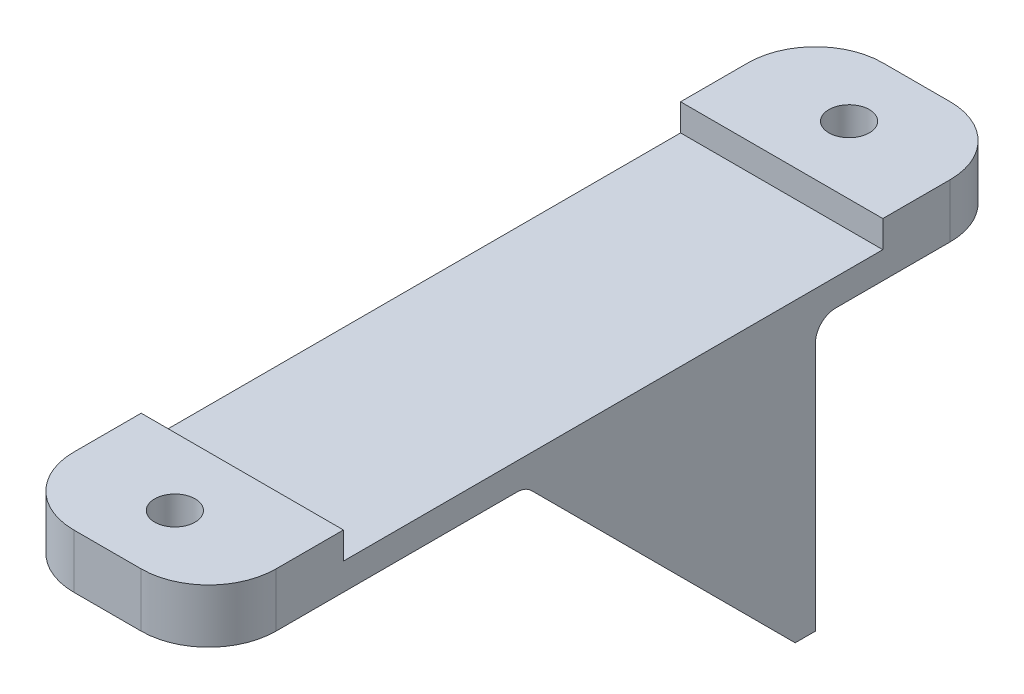
ISO-10303-21;
HEADER;
FILE_DESCRIPTION(('STEP AP214'),'2;1');
FILE_NAME('part.step','',(''),(''),'','','');
FILE_SCHEMA(('AUTOMOTIVE_DESIGN { 1 0 10303 214 1 1 1 1 }'));
ENDSEC;
DATA;
#1=APPLICATION_CONTEXT('core data for automotive mechanical design processes');
#2=APPLICATION_PROTOCOL_DEFINITION('international standard','automotive_design',2000,#1);
#3=PRODUCT_CONTEXT('',#1,'mechanical');
#4=PRODUCT('Part','Part','',(#3));
#5=PRODUCT_RELATED_PRODUCT_CATEGORY('part','',(#4));
#6=PRODUCT_DEFINITION_FORMATION('','',#4);
#7=PRODUCT_DEFINITION_CONTEXT('part definition',#1,'design');
#8=PRODUCT_DEFINITION('design','',#6,#7);
#9=PRODUCT_DEFINITION_SHAPE('','',#8);
#10=(LENGTH_UNIT() NAMED_UNIT(*) SI_UNIT(.MILLI.,.METRE.));
#11=(NAMED_UNIT(*) PLANE_ANGLE_UNIT() SI_UNIT($,.RADIAN.));
#12=(NAMED_UNIT(*) SI_UNIT($,.STERADIAN.) SOLID_ANGLE_UNIT());
#13=UNCERTAINTY_MEASURE_WITH_UNIT(LENGTH_MEASURE(1.E-05),#10,'distance_accuracy_value','');
#14=(GEOMETRIC_REPRESENTATION_CONTEXT(3) GLOBAL_UNCERTAINTY_ASSIGNED_CONTEXT((#13)) GLOBAL_UNIT_ASSIGNED_CONTEXT((#10,
#11,#12)) REPRESENTATION_CONTEXT('',''));
#15=CARTESIAN_POINT('',(0.,0.,0.));
#16=DIRECTION('',(0.,0.,1.));
#17=DIRECTION('',(1.,0.,0.));
#18=AXIS2_PLACEMENT_3D('',#15,#16,#17);
#19=CARTESIAN_POINT('',(0.,-40.,-87.));
#20=DIRECTION('',(0.,0.,-1.));
#21=DIRECTION('',(-1.,0.,0.));
#22=AXIS2_PLACEMENT_3D('',#19,#20,#21);
#23=PLANE('',#22);
#24=CARTESIAN_POINT('',(15.,-20.,-87.));
#25=DIRECTION('',(0.,0.,1.));
#26=DIRECTION('',(1.,0.,0.));
#27=AXIS2_PLACEMENT_3D('',#24,#25,#26);
#28=CIRCLE('',#27,9.1);
#29=CARTESIAN_POINT('',(24.1,-20.,-87.));
#30=VERTEX_POINT('',#29);
#31=EDGE_CURVE('E226',#30,#30,#28,.T.);
#32=ORIENTED_EDGE('',*,*,#31,.F.);
#33=EDGE_LOOP('',(#32));
#34=FACE_BOUND('',#33,.T.);
#35=DIRECTION('',(0.,-1.,0.));
#36=VECTOR('',#35,1.);
#37=CARTESIAN_POINT('',(2.5,-40.,-87.));
#38=LINE('',#37,#36);
#39=CARTESIAN_POINT('',(2.5,0.,-87.));
#40=VERTEX_POINT('',#39);
#41=CARTESIAN_POINT('',(2.5,-40.,-87.));
#42=VERTEX_POINT('',#41);
#43=EDGE_CURVE('E192',#40,#42,#38,.T.);
#44=ORIENTED_EDGE('',*,*,#43,.T.);
#45=DIRECTION('',(-1.,0.,0.));
#46=VECTOR('',#45,1.);
#47=CARTESIAN_POINT('',(0.,-40.,-87.));
#48=LINE('',#47,#46);
#49=CARTESIAN_POINT('',(27.5,-40.,-87.));
#50=VERTEX_POINT('',#49);
#51=EDGE_CURVE('E435',#50,#42,#48,.T.);
#52=ORIENTED_EDGE('',*,*,#51,.F.);
#53=DIRECTION('',(0.,1.,0.));
#54=VECTOR('',#53,1.);
#55=CARTESIAN_POINT('',(27.5,0.,-87.));
#56=LINE('',#55,#54);
#57=CARTESIAN_POINT('',(27.5,0.,-87.));
#58=VERTEX_POINT('',#57);
#59=EDGE_CURVE('E215',#50,#58,#56,.T.);
#60=ORIENTED_EDGE('',*,*,#59,.T.);
#61=DIRECTION('',(-1.,0.,0.));
#62=VECTOR('',#61,1.);
#63=CARTESIAN_POINT('',(0.,0.,-87.));
#64=LINE('',#63,#62);
#65=EDGE_CURVE('E207',#58,#40,#64,.T.);
#66=ORIENTED_EDGE('',*,*,#65,.T.);
#67=EDGE_LOOP('',(#44,#52,#60,#66));
#68=FACE_BOUND('',#67,.T.);
#69=ADVANCED_FACE('F45',(#34,#68),#23,.F.);
#70=CARTESIAN_POINT('',(0.,0.,0.));
#71=DIRECTION('',(0.,-1.,0.));
#72=DIRECTION('',(0.,0.,-1.));
#73=AXIS2_PLACEMENT_3D('',#70,#71,#72);
#74=PLANE('',#73);
#75=CARTESIAN_POINT('',(15.,0.,-10.));
#76=DIRECTION('',(0.,-1.,0.));
#77=DIRECTION('',(0.,0.,-1.));
#78=AXIS2_PLACEMENT_3D('',#75,#76,#77);
#79=CIRCLE('',#78,3.);
#80=CARTESIAN_POINT('',(15.,0.,-13.));
#81=VERTEX_POINT('',#80);
#82=EDGE_CURVE('E593',#81,#81,#79,.T.);
#83=ORIENTED_EDGE('',*,*,#82,.F.);
#84=EDGE_LOOP('',(#83));
#85=FACE_BOUND('',#84,.T.);
#86=DIRECTION('',(0.,0.,1.));
#87=VECTOR('',#86,1.);
#88=CARTESIAN_POINT('',(27.5,0.,-46.9999999999996));
#89=LINE('',#88,#87);
#90=CARTESIAN_POINT('',(27.5,0.,-45.7573593128803));
#91=VERTEX_POINT('',#90);
#92=EDGE_CURVE('E420',#58,#91,#89,.T.);
#93=ORIENTED_EDGE('',*,*,#92,.T.);
#94=DIRECTION('',(1.,0.,0.));
#95=VECTOR('',#94,1.);
#96=CARTESIAN_POINT('',(30.,0.,-45.7573593128803));
#97=LINE('',#96,#95);
#98=CARTESIAN_POINT('',(30.,0.,-45.7573593128803));
#99=VERTEX_POINT('',#98);
#100=EDGE_CURVE('E380',#91,#99,#97,.T.);
#101=ORIENTED_EDGE('',*,*,#100,.T.);
#102=DIRECTION('',(0.,0.,-1.));
#103=VECTOR('',#102,1.);
#104=CARTESIAN_POINT('',(30.,0.,0.));
#105=LINE('',#104,#103);
#106=CARTESIAN_POINT('',(30.,0.,-10.));
#107=VERTEX_POINT('',#106);
#108=EDGE_CURVE('E304',#107,#99,#105,.T.);
#109=ORIENTED_EDGE('',*,*,#108,.F.);
#110=CARTESIAN_POINT('',(20.,0.,-10.));
#111=DIRECTION('',(0.,-1.,0.));
#112=DIRECTION('',(0.,0.,-1.));
#113=AXIS2_PLACEMENT_3D('',#110,#111,#112);
#114=CIRCLE('',#113,10.);
#115=CARTESIAN_POINT('',(20.,0.,0.));
#116=VERTEX_POINT('',#115);
#117=EDGE_CURVE('E349',#107,#116,#114,.T.);
#118=ORIENTED_EDGE('',*,*,#117,.T.);
#119=DIRECTION('',(1.,0.,0.));
#120=VECTOR('',#119,1.);
#121=CARTESIAN_POINT('',(0.,0.,0.));
#122=LINE('',#121,#120);
#123=CARTESIAN_POINT('',(10.,0.,0.));
#124=VERTEX_POINT('',#123);
#125=EDGE_CURVE('E299',#124,#116,#122,.T.);
#126=ORIENTED_EDGE('',*,*,#125,.F.);
#127=CARTESIAN_POINT('',(10.,0.,-10.));
#128=DIRECTION('',(0.,-1.,0.));
#129=DIRECTION('',(0.,0.,-1.));
#130=AXIS2_PLACEMENT_3D('',#127,#128,#129);
#131=CIRCLE('',#130,10.);
#132=CARTESIAN_POINT('',(0.,0.,-10.));
#133=VERTEX_POINT('',#132);
#134=EDGE_CURVE('E345',#124,#133,#131,.T.);
#135=ORIENTED_EDGE('',*,*,#134,.T.);
#136=DIRECTION('',(0.,0.,1.));
#137=VECTOR('',#136,1.);
#138=CARTESIAN_POINT('',(0.,0.,0.));
#139=LINE('',#138,#137);
#140=CARTESIAN_POINT('',(0.,0.,-45.7573593128803));
#141=VERTEX_POINT('',#140);
#142=EDGE_CURVE('E268',#141,#133,#139,.T.);
#143=ORIENTED_EDGE('',*,*,#142,.F.);
#144=DIRECTION('',(-1.,0.,0.));
#145=VECTOR('',#144,1.);
#146=CARTESIAN_POINT('',(2.5,0.,-45.7573593128803));
#147=LINE('',#146,#145);
#148=CARTESIAN_POINT('',(2.5,0.,-45.7573593128803));
#149=VERTEX_POINT('',#148);
#150=EDGE_CURVE('E209',#141,#149,#147,.F.);
#151=ORIENTED_EDGE('',*,*,#150,.T.);
#152=DIRECTION('',(0.,0.,-1.));
#153=VECTOR('',#152,1.);
#154=CARTESIAN_POINT('',(2.5,0.,-87.));
#155=LINE('',#154,#153);
#156=EDGE_CURVE('E195',#149,#40,#155,.T.);
#157=ORIENTED_EDGE('',*,*,#156,.T.);
#158=ORIENTED_EDGE('',*,*,#65,.F.);
#159=EDGE_LOOP('',(#93,#101,#109,#118,#126,#135,#143,#151,#157,#158));
#160=FACE_BOUND('',#159,.T.);
#161=ADVANCED_FACE('F206',(#85,#160),#74,.T.);
#162=CARTESIAN_POINT('',(0.,8.,0.));
#163=DIRECTION('',(0.,-1.,0.));
#164=DIRECTION('',(0.,0.,-1.));
#165=AXIS2_PLACEMENT_3D('',#162,#163,#164);
#166=PLANE('',#165);
#167=CARTESIAN_POINT('',(15.,8.,-110.));
#168=DIRECTION('',(0.,-1.,0.));
#169=DIRECTION('',(0.,0.,-1.));
#170=AXIS2_PLACEMENT_3D('',#167,#168,#169);
#171=CIRCLE('',#170,3.);
#172=CARTESIAN_POINT('',(15.,8.,-113.));
#173=VERTEX_POINT('',#172);
#174=EDGE_CURVE('E586',#173,#173,#171,.T.);
#175=ORIENTED_EDGE('',*,*,#174,.T.);
#176=EDGE_LOOP('',(#175));
#177=FACE_BOUND('',#176,.T.);
#178=DIRECTION('',(0.,0.,-1.));
#179=VECTOR('',#178,1.);
#180=CARTESIAN_POINT('',(30.,8.,0.));
#181=LINE('',#180,#179);
#182=CARTESIAN_POINT('',(30.,8.,-100.));
#183=VERTEX_POINT('',#182);
#184=CARTESIAN_POINT('',(30.,8.,-110.));
#185=VERTEX_POINT('',#184);
#186=EDGE_CURVE('E286',#183,#185,#181,.T.);
#187=ORIENTED_EDGE('',*,*,#186,.T.);
#188=CARTESIAN_POINT('',(20.,8.,-110.));
#189=DIRECTION('',(0.,-1.,0.));
#190=DIRECTION('',(0.,0.,-1.));
#191=AXIS2_PLACEMENT_3D('',#188,#189,#190);
#192=CIRCLE('',#191,10.);
#193=CARTESIAN_POINT('',(20.,8.,-120.));
#194=VERTEX_POINT('',#193);
#195=EDGE_CURVE('E335',#185,#194,#192,.F.);
#196=ORIENTED_EDGE('',*,*,#195,.T.);
#197=DIRECTION('',(-1.,0.,0.));
#198=VECTOR('',#197,1.);
#199=CARTESIAN_POINT('',(0.,8.,-120.));
#200=LINE('',#199,#198);
#201=CARTESIAN_POINT('',(10.,8.,-120.));
#202=VERTEX_POINT('',#201);
#203=EDGE_CURVE('E290',#194,#202,#200,.T.);
#204=ORIENTED_EDGE('',*,*,#203,.T.);
#205=CARTESIAN_POINT('',(10.,8.,-110.));
#206=DIRECTION('',(0.,-1.,0.));
#207=DIRECTION('',(0.,0.,-1.));
#208=AXIS2_PLACEMENT_3D('',#205,#206,#207);
#209=CIRCLE('',#208,10.);
#210=CARTESIAN_POINT('',(0.,8.,-110.));
#211=VERTEX_POINT('',#210);
#212=EDGE_CURVE('E332',#202,#211,#209,.F.);
#213=ORIENTED_EDGE('',*,*,#212,.T.);
#214=DIRECTION('',(0.,0.,1.));
#215=VECTOR('',#214,1.);
#216=CARTESIAN_POINT('',(0.,8.,0.));
#217=LINE('',#216,#215);
#218=CARTESIAN_POINT('',(0.,8.,-100.));
#219=VERTEX_POINT('',#218);
#220=EDGE_CURVE('E278',#211,#219,#217,.T.);
#221=ORIENTED_EDGE('',*,*,#220,.T.);
#222=DIRECTION('',(-1.,0.,0.));
#223=VECTOR('',#222,1.);
#224=CARTESIAN_POINT('',(30.,8.,-100.));
#225=LINE('',#224,#223);
#226=EDGE_CURVE('E246',#183,#219,#225,.T.);
#227=ORIENTED_EDGE('',*,*,#226,.F.);
#228=EDGE_LOOP('',(#187,#196,#204,#213,#221,#227));
#229=FACE_BOUND('',#228,.T.);
#230=ADVANCED_FACE('F491',(#177,#229),#166,.F.);
#231=CARTESIAN_POINT('',(0.,8.,0.));
#232=DIRECTION('',(1.,0.,0.));
#233=DIRECTION('',(0.,0.,-1.));
#234=AXIS2_PLACEMENT_3D('',#231,#232,#233);
#235=PLANE('',#234);
#236=ORIENTED_EDGE('',*,*,#220,.F.);
#237=DIRECTION('',(0.,-1.,0.));
#238=VECTOR('',#237,1.);
#239=CARTESIAN_POINT('',(0.,8.,-110.));
#240=LINE('',#239,#238);
#241=CARTESIAN_POINT('',(0.,0.,-110.));
#242=VERTEX_POINT('',#241);
#243=EDGE_CURVE('E341',#211,#242,#240,.T.);
#244=ORIENTED_EDGE('',*,*,#243,.T.);
#245=CARTESIAN_POINT('',(0.,0.,-93.));
#246=VERTEX_POINT('',#245);
#247=EDGE_CURVE('E295',#242,#246,#139,.T.);
#248=ORIENTED_EDGE('',*,*,#247,.T.);
#249=CARTESIAN_POINT('',(0.,-3.,-93.));
#250=DIRECTION('',(1.,0.,0.));
#251=DIRECTION('',(0.,0.,-1.));
#252=AXIS2_PLACEMENT_3D('',#249,#250,#251);
#253=CIRCLE('',#252,3.);
#254=CARTESIAN_POINT('',(0.,-3.,-90.));
#255=VERTEX_POINT('',#254);
#256=EDGE_CURVE('E375',#246,#255,#253,.T.);
#257=ORIENTED_EDGE('',*,*,#256,.T.);
#258=DIRECTION('',(0.,1.,0.));
#259=VECTOR('',#258,1.);
#260=CARTESIAN_POINT('',(0.,-40.,-90.));
#261=LINE('',#260,#259);
#262=CARTESIAN_POINT('',(0.,-40.,-90.));
#263=VERTEX_POINT('',#262);
#264=EDGE_CURVE('E236',#263,#255,#261,.T.);
#265=ORIENTED_EDGE('',*,*,#264,.F.);
#266=DIRECTION('',(0.,0.,-1.));
#267=VECTOR('',#266,1.);
#268=CARTESIAN_POINT('',(0.,-40.,-87.));
#269=LINE('',#268,#267);
#270=CARTESIAN_POINT('',(0.,-40.,-87.));
#271=VERTEX_POINT('',#270);
#272=EDGE_CURVE('E217',#271,#263,#269,.T.);
#273=ORIENTED_EDGE('',*,*,#272,.F.);
#274=DIRECTION('',(0.,0.707106781186544,0.707106781186551));
#275=VECTOR('',#274,1.);
#276=CARTESIAN_POINT('',(0.,0.,-46.9999999999996));
#277=LINE('',#276,#275);
#278=CARTESIAN_POINT('',(0.,-0.878679656440344,-47.8786796564399));
#279=VERTEX_POINT('',#278);
#280=EDGE_CURVE('E211',#271,#279,#277,.T.);
#281=ORIENTED_EDGE('',*,*,#280,.T.);
#282=CARTESIAN_POINT('',(0.,-3.,-45.7573593128803));
#283=DIRECTION('',(1.,0.,0.));
#284=DIRECTION('',(0.,0.,-1.));
#285=AXIS2_PLACEMENT_3D('',#282,#283,#284);
#286=CIRCLE('',#285,3.);
#287=EDGE_CURVE('E54',#279,#141,#286,.T.);
#288=ORIENTED_EDGE('',*,*,#287,.T.);
#289=ORIENTED_EDGE('',*,*,#142,.T.);
#290=DIRECTION('',(0.,-1.,0.));
#291=VECTOR('',#290,1.);
#292=CARTESIAN_POINT('',(0.,8.,-10.));
#293=LINE('',#292,#291);
#294=CARTESIAN_POINT('',(0.,8.,-10.));
#295=VERTEX_POINT('',#294);
#296=EDGE_CURVE('E338',#133,#295,#293,.F.);
#297=ORIENTED_EDGE('',*,*,#296,.T.);
#298=CARTESIAN_POINT('',(0.,8.,-20.));
#299=VERTEX_POINT('',#298);
#300=EDGE_CURVE('E282',#299,#295,#217,.T.);
#301=ORIENTED_EDGE('',*,*,#300,.F.);
#302=DIRECTION('',(0.,1.,0.));
#303=VECTOR('',#302,1.);
#304=CARTESIAN_POINT('',(0.,4.,-20.));
#305=LINE('',#304,#303);
#306=CARTESIAN_POINT('',(0.,4.,-20.));
#307=VERTEX_POINT('',#306);
#308=EDGE_CURVE('E257',#307,#299,#305,.T.);
#309=ORIENTED_EDGE('',*,*,#308,.F.);
#310=DIRECTION('',(0.,0.,1.));
#311=VECTOR('',#310,1.);
#312=CARTESIAN_POINT('',(0.,4.,-100.));
#313=LINE('',#312,#311);
#314=CARTESIAN_POINT('',(0.,4.,-100.));
#315=VERTEX_POINT('',#314);
#316=EDGE_CURVE('E241',#315,#307,#313,.T.);
#317=ORIENTED_EDGE('',*,*,#316,.F.);
#318=DIRECTION('',(0.,1.,0.));
#319=VECTOR('',#318,1.);
#320=CARTESIAN_POINT('',(0.,4.,-100.));
#321=LINE('',#320,#319);
#322=EDGE_CURVE('E264',#315,#219,#321,.T.);
#323=ORIENTED_EDGE('',*,*,#322,.T.);
#324=EDGE_LOOP('',(#236,#244,#248,#257,#265,#273,#281,#288,#289,#297,#301,#309,#317,#323));
#325=FACE_BOUND('',#324,.T.);
#326=ADVANCED_FACE('F400',(#325),#235,.F.);
#327=CARTESIAN_POINT('',(0.,8.,0.));
#328=DIRECTION('',(0.,0.,-1.));
#329=DIRECTION('',(-1.,0.,0.));
#330=AXIS2_PLACEMENT_3D('',#327,#328,#329);
#331=PLANE('',#330);
#332=ORIENTED_EDGE('',*,*,#125,.T.);
#333=DIRECTION('',(0.,-1.,0.));
#334=VECTOR('',#333,1.);
#335=CARTESIAN_POINT('',(20.,8.,0.));
#336=LINE('',#335,#334);
#337=CARTESIAN_POINT('',(20.,8.,0.));
#338=VERTEX_POINT('',#337);
#339=EDGE_CURVE('E356',#116,#338,#336,.F.);
#340=ORIENTED_EDGE('',*,*,#339,.T.);
#341=DIRECTION('',(1.,0.,0.));
#342=VECTOR('',#341,1.);
#343=CARTESIAN_POINT('',(0.,8.,0.));
#344=LINE('',#343,#342);
#345=CARTESIAN_POINT('',(10.,8.,0.));
#346=VERTEX_POINT('',#345);
#347=EDGE_CURVE('E281',#346,#338,#344,.T.);
#348=ORIENTED_EDGE('',*,*,#347,.F.);
#349=DIRECTION('',(0.,-1.,0.));
#350=VECTOR('',#349,1.);
#351=CARTESIAN_POINT('',(10.,8.,0.));
#352=LINE('',#351,#350);
#353=EDGE_CURVE('E352',#346,#124,#352,.T.);
#354=ORIENTED_EDGE('',*,*,#353,.T.);
#355=EDGE_LOOP('',(#332,#340,#348,#354));
#356=FACE_BOUND('',#355,.T.);
#357=ADVANCED_FACE('F463',(#356),#331,.F.);
#358=CARTESIAN_POINT('',(30.,8.,0.));
#359=DIRECTION('',(-1.,0.,0.));
#360=DIRECTION('',(0.,0.,1.));
#361=AXIS2_PLACEMENT_3D('',#358,#359,#360);
#362=PLANE('',#361);
#363=DIRECTION('',(0.,1.,0.));
#364=VECTOR('',#363,1.);
#365=CARTESIAN_POINT('',(30.,-40.,-90.));
#366=LINE('',#365,#364);
#367=CARTESIAN_POINT('',(30.,-40.,-90.));
#368=VERTEX_POINT('',#367);
#369=CARTESIAN_POINT('',(30.,-3.,-90.));
#370=VERTEX_POINT('',#369);
#371=EDGE_CURVE('E232',#368,#370,#366,.T.);
#372=ORIENTED_EDGE('',*,*,#371,.T.);
#373=CARTESIAN_POINT('',(30.,-3.,-93.));
#374=DIRECTION('',(-1.,0.,0.));
#375=DIRECTION('',(0.,0.,1.));
#376=AXIS2_PLACEMENT_3D('',#373,#374,#375);
#377=CIRCLE('',#376,3.);
#378=CARTESIAN_POINT('',(30.,0.,-93.));
#379=VERTEX_POINT('',#378);
#380=EDGE_CURVE('E372',#370,#379,#377,.T.);
#381=ORIENTED_EDGE('',*,*,#380,.T.);
#382=CARTESIAN_POINT('',(30.,0.,-110.));
#383=VERTEX_POINT('',#382);
#384=EDGE_CURVE('E303',#379,#383,#105,.T.);
#385=ORIENTED_EDGE('',*,*,#384,.T.);
#386=DIRECTION('',(0.,-1.,0.));
#387=VECTOR('',#386,1.);
#388=CARTESIAN_POINT('',(30.,8.,-110.));
#389=LINE('',#388,#387);
#390=EDGE_CURVE('E329',#383,#185,#389,.F.);
#391=ORIENTED_EDGE('',*,*,#390,.T.);
#392=ORIENTED_EDGE('',*,*,#186,.F.);
#393=DIRECTION('',(0.,1.,0.));
#394=VECTOR('',#393,1.);
#395=CARTESIAN_POINT('',(30.,4.,-100.));
#396=LINE('',#395,#394);
#397=CARTESIAN_POINT('',(30.,4.,-100.));
#398=VERTEX_POINT('',#397);
#399=EDGE_CURVE('E269',#398,#183,#396,.T.);
#400=ORIENTED_EDGE('',*,*,#399,.F.);
#401=DIRECTION('',(0.,0.,-1.));
#402=VECTOR('',#401,1.);
#403=CARTESIAN_POINT('',(30.,4.,-100.));
#404=LINE('',#403,#402);
#405=CARTESIAN_POINT('',(30.,4.,-20.));
#406=VERTEX_POINT('',#405);
#407=EDGE_CURVE('E250',#406,#398,#404,.T.);
#408=ORIENTED_EDGE('',*,*,#407,.F.);
#409=DIRECTION('',(0.,1.,0.));
#410=VECTOR('',#409,1.);
#411=CARTESIAN_POINT('',(30.,4.,-20.));
#412=LINE('',#411,#410);
#413=CARTESIAN_POINT('',(30.,8.,-20.));
#414=VERTEX_POINT('',#413);
#415=EDGE_CURVE('E272',#406,#414,#412,.T.);
#416=ORIENTED_EDGE('',*,*,#415,.T.);
#417=CARTESIAN_POINT('',(30.,8.,-10.));
#418=VERTEX_POINT('',#417);
#419=EDGE_CURVE('E287',#418,#414,#181,.T.);
#420=ORIENTED_EDGE('',*,*,#419,.F.);
#421=DIRECTION('',(0.,-1.,0.));
#422=VECTOR('',#421,1.);
#423=CARTESIAN_POINT('',(30.,8.,-10.));
#424=LINE('',#423,#422);
#425=EDGE_CURVE('E325',#418,#107,#424,.T.);
#426=ORIENTED_EDGE('',*,*,#425,.T.);
#427=ORIENTED_EDGE('',*,*,#108,.T.);
#428=CARTESIAN_POINT('',(30.,-3.,-45.7573593128803));
#429=DIRECTION('',(-1.,0.,0.));
#430=DIRECTION('',(0.,0.,1.));
#431=AXIS2_PLACEMENT_3D('',#428,#429,#430);
#432=CIRCLE('',#431,3.);
#433=CARTESIAN_POINT('',(30.,-0.878679656440354,-47.8786796564399));
#434=VERTEX_POINT('',#433);
#435=EDGE_CURVE('E390',#99,#434,#432,.T.);
#436=ORIENTED_EDGE('',*,*,#435,.T.);
#437=DIRECTION('',(0.,-0.707106781186544,-0.707106781186551));
#438=VECTOR('',#437,1.);
#439=CARTESIAN_POINT('',(30.,-40.,-87.));
#440=LINE('',#439,#438);
#441=CARTESIAN_POINT('',(30.,-40.,-87.));
#442=VERTEX_POINT('',#441);
#443=EDGE_CURVE('E412',#434,#442,#440,.T.);
#444=ORIENTED_EDGE('',*,*,#443,.T.);
#445=DIRECTION('',(0.,0.,1.));
#446=VECTOR('',#445,1.);
#447=CARTESIAN_POINT('',(30.,-40.,-87.));
#448=LINE('',#447,#446);
#449=EDGE_CURVE('E432',#368,#442,#448,.T.);
#450=ORIENTED_EDGE('',*,*,#449,.F.);
#451=EDGE_LOOP('',(#372,#381,#385,#391,#392,#400,#408,#416,#420,#426,#427,#436,#444,#450));
#452=FACE_BOUND('',#451,.T.);
#453=ADVANCED_FACE('F455',(#452),#362,.F.);
#454=CARTESIAN_POINT('',(0.,8.,-120.));
#455=DIRECTION('',(0.,0.,1.));
#456=DIRECTION('',(1.,0.,0.));
#457=AXIS2_PLACEMENT_3D('',#454,#455,#456);
#458=PLANE('',#457);
#459=ORIENTED_EDGE('',*,*,#203,.F.);
#460=DIRECTION('',(0.,-1.,0.));
#461=VECTOR('',#460,1.);
#462=CARTESIAN_POINT('',(20.,8.,-120.));
#463=LINE('',#462,#461);
#464=CARTESIAN_POINT('',(20.,0.,-120.));
#465=VERTEX_POINT('',#464);
#466=EDGE_CURVE('E314',#194,#465,#463,.T.);
#467=ORIENTED_EDGE('',*,*,#466,.T.);
#468=DIRECTION('',(-1.,0.,0.));
#469=VECTOR('',#468,1.);
#470=CARTESIAN_POINT('',(0.,0.,-120.));
#471=LINE('',#470,#469);
#472=CARTESIAN_POINT('',(10.,0.,-120.));
#473=VERTEX_POINT('',#472);
#474=EDGE_CURVE('E308',#465,#473,#471,.T.);
#475=ORIENTED_EDGE('',*,*,#474,.T.);
#476=DIRECTION('',(0.,-1.,0.));
#477=VECTOR('',#476,1.);
#478=CARTESIAN_POINT('',(10.,8.,-120.));
#479=LINE('',#478,#477);
#480=EDGE_CURVE('E294',#473,#202,#479,.F.);
#481=ORIENTED_EDGE('',*,*,#480,.T.);
#482=EDGE_LOOP('',(#459,#467,#475,#481));
#483=FACE_BOUND('',#482,.T.);
#484=ADVANCED_FACE('F495',(#483),#458,.F.);
#485=CARTESIAN_POINT('',(15.,8.,-10.));
#486=DIRECTION('',(0.,-1.,0.));
#487=DIRECTION('',(0.,0.,-1.));
#488=AXIS2_PLACEMENT_3D('',#485,#486,#487);
#489=CIRCLE('',#488,3.);
#490=CARTESIAN_POINT('',(15.,8.,-13.));
#491=VERTEX_POINT('',#490);
#492=EDGE_CURVE('E416',#491,#491,#489,.T.);
#493=ORIENTED_EDGE('',*,*,#492,.T.);
#494=EDGE_LOOP('',(#493));
#495=FACE_BOUND('',#494,.T.);
#496=ORIENTED_EDGE('',*,*,#347,.T.);
#497=CARTESIAN_POINT('',(20.,8.,-10.));
#498=DIRECTION('',(0.,-1.,0.));
#499=DIRECTION('',(0.,0.,-1.));
#500=AXIS2_PLACEMENT_3D('',#497,#498,#499);
#501=CIRCLE('',#500,10.);
#502=EDGE_CURVE('E362',#338,#418,#501,.F.);
#503=ORIENTED_EDGE('',*,*,#502,.T.);
#504=ORIENTED_EDGE('',*,*,#419,.T.);
#505=DIRECTION('',(1.,0.,0.));
#506=VECTOR('',#505,1.);
#507=CARTESIAN_POINT('',(30.,8.,-20.));
#508=LINE('',#507,#506);
#509=EDGE_CURVE('E240',#299,#414,#508,.T.);
#510=ORIENTED_EDGE('',*,*,#509,.F.);
#511=ORIENTED_EDGE('',*,*,#300,.T.);
#512=CARTESIAN_POINT('',(10.,8.,-10.));
#513=DIRECTION('',(0.,-1.,0.));
#514=DIRECTION('',(0.,0.,-1.));
#515=AXIS2_PLACEMENT_3D('',#512,#513,#514);
#516=CIRCLE('',#515,10.);
#517=EDGE_CURVE('E359',#295,#346,#516,.F.);
#518=ORIENTED_EDGE('',*,*,#517,.T.);
#519=EDGE_LOOP('',(#496,#503,#504,#510,#511,#518));
#520=FACE_BOUND('',#519,.T.);
#521=ADVANCED_FACE('F474',(#495,#520),#166,.F.);
#522=CARTESIAN_POINT('',(15.,0.,-110.));
#523=DIRECTION('',(0.,-1.,0.));
#524=DIRECTION('',(0.,0.,-1.));
#525=AXIS2_PLACEMENT_3D('',#522,#523,#524);
#526=CIRCLE('',#525,3.);
#527=CARTESIAN_POINT('',(15.,0.,-113.));
#528=VERTEX_POINT('',#527);
#529=EDGE_CURVE('E589',#528,#528,#526,.T.);
#530=ORIENTED_EDGE('',*,*,#529,.F.);
#531=EDGE_LOOP('',(#530));
#532=FACE_BOUND('',#531,.T.);
#533=ORIENTED_EDGE('',*,*,#384,.F.);
#534=DIRECTION('',(1.,0.,0.));
#535=VECTOR('',#534,1.);
#536=CARTESIAN_POINT('',(0.,0.,-93.));
#537=LINE('',#536,#535);
#538=EDGE_CURVE('E369',#379,#246,#537,.F.);
#539=ORIENTED_EDGE('',*,*,#538,.T.);
#540=ORIENTED_EDGE('',*,*,#247,.F.);
#541=CARTESIAN_POINT('',(10.,0.,-110.));
#542=DIRECTION('',(0.,-1.,0.));
#543=DIRECTION('',(0.,0.,-1.));
#544=AXIS2_PLACEMENT_3D('',#541,#542,#543);
#545=CIRCLE('',#544,10.);
#546=EDGE_CURVE('E318',#242,#473,#545,.T.);
#547=ORIENTED_EDGE('',*,*,#546,.T.);
#548=ORIENTED_EDGE('',*,*,#474,.F.);
#549=CARTESIAN_POINT('',(20.,0.,-110.));
#550=DIRECTION('',(0.,-1.,0.));
#551=DIRECTION('',(0.,0.,-1.));
#552=AXIS2_PLACEMENT_3D('',#549,#550,#551);
#553=CIRCLE('',#552,10.);
#554=EDGE_CURVE('E321',#465,#383,#553,.T.);
#555=ORIENTED_EDGE('',*,*,#554,.T.);
#556=EDGE_LOOP('',(#533,#539,#540,#547,#548,#555));
#557=FACE_BOUND('',#556,.T.);
#558=ADVANCED_FACE('F484',(#532,#557),#74,.T.);
#559=CARTESIAN_POINT('',(30.,4.,-100.));
#560=DIRECTION('',(0.,0.,-1.));
#561=DIRECTION('',(-1.,0.,0.));
#562=AXIS2_PLACEMENT_3D('',#559,#560,#561);
#563=PLANE('',#562);
#564=ORIENTED_EDGE('',*,*,#226,.T.);
#565=ORIENTED_EDGE('',*,*,#322,.F.);
#566=DIRECTION('',(-1.,0.,0.));
#567=VECTOR('',#566,1.);
#568=CARTESIAN_POINT('',(30.,4.,-100.));
#569=LINE('',#568,#567);
#570=EDGE_CURVE('E253',#398,#315,#569,.T.);
#571=ORIENTED_EDGE('',*,*,#570,.F.);
#572=ORIENTED_EDGE('',*,*,#399,.T.);
#573=EDGE_LOOP('',(#564,#565,#571,#572));
#574=FACE_BOUND('',#573,.T.);
#575=ADVANCED_FACE('F504',(#574),#563,.F.);
#576=CARTESIAN_POINT('',(30.,4.,-20.));
#577=DIRECTION('',(0.,0.,1.));
#578=DIRECTION('',(1.,0.,0.));
#579=AXIS2_PLACEMENT_3D('',#576,#577,#578);
#580=PLANE('',#579);
#581=ORIENTED_EDGE('',*,*,#509,.T.);
#582=ORIENTED_EDGE('',*,*,#415,.F.);
#583=DIRECTION('',(1.,0.,0.));
#584=VECTOR('',#583,1.);
#585=CARTESIAN_POINT('',(30.,4.,-20.));
#586=LINE('',#585,#584);
#587=EDGE_CURVE('E245',#307,#406,#586,.T.);
#588=ORIENTED_EDGE('',*,*,#587,.F.);
#589=ORIENTED_EDGE('',*,*,#308,.T.);
#590=EDGE_LOOP('',(#581,#582,#588,#589));
#591=FACE_BOUND('',#590,.T.);
#592=ADVANCED_FACE('F511',(#591),#580,.F.);
#593=CARTESIAN_POINT('',(0.,4.,0.));
#594=DIRECTION('',(0.,-1.,0.));
#595=DIRECTION('',(0.,0.,-1.));
#596=AXIS2_PLACEMENT_3D('',#593,#594,#595);
#597=PLANE('',#596);
#598=ORIENTED_EDGE('',*,*,#316,.T.);
#599=ORIENTED_EDGE('',*,*,#587,.T.);
#600=ORIENTED_EDGE('',*,*,#407,.T.);
#601=ORIENTED_EDGE('',*,*,#570,.T.);
#602=EDGE_LOOP('',(#598,#599,#600,#601));
#603=FACE_BOUND('',#602,.T.);
#604=ADVANCED_FACE('F507',(#603),#597,.F.);
#605=CARTESIAN_POINT('',(0.,-40.,-90.));
#606=DIRECTION('',(0.,0.,1.));
#607=DIRECTION('',(1.,0.,0.));
#608=AXIS2_PLACEMENT_3D('',#605,#606,#607);
#609=PLANE('',#608);
#610=CARTESIAN_POINT('',(15.,-20.,-90.));
#611=DIRECTION('',(0.,0.,1.));
#612=DIRECTION('',(1.,0.,0.));
#613=AXIS2_PLACEMENT_3D('',#610,#611,#612);
#614=CIRCLE('',#613,9.1);
#615=CARTESIAN_POINT('',(24.1,-20.,-90.));
#616=VERTEX_POINT('',#615);
#617=EDGE_CURVE('E218',#616,#616,#614,.T.);
#618=ORIENTED_EDGE('',*,*,#617,.T.);
#619=EDGE_LOOP('',(#618));
#620=FACE_BOUND('',#619,.T.);
#621=ORIENTED_EDGE('',*,*,#264,.T.);
#622=DIRECTION('',(1.,0.,0.));
#623=VECTOR('',#622,1.);
#624=CARTESIAN_POINT('',(0.,-3.,-90.));
#625=LINE('',#624,#623);
#626=EDGE_CURVE('E365',#255,#370,#625,.T.);
#627=ORIENTED_EDGE('',*,*,#626,.T.);
#628=ORIENTED_EDGE('',*,*,#371,.F.);
#629=DIRECTION('',(1.,0.,0.));
#630=VECTOR('',#629,1.);
#631=CARTESIAN_POINT('',(0.,-40.,-90.));
#632=LINE('',#631,#630);
#633=EDGE_CURVE('E223',#263,#368,#632,.T.);
#634=ORIENTED_EDGE('',*,*,#633,.F.);
#635=EDGE_LOOP('',(#621,#627,#628,#634));
#636=FACE_BOUND('',#635,.T.);
#637=ADVANCED_FACE('F518',(#620,#636),#609,.F.);
#638=CARTESIAN_POINT('',(0.,-40.,0.));
#639=DIRECTION('',(0.,-1.,0.));
#640=DIRECTION('',(0.,0.,-1.));
#641=AXIS2_PLACEMENT_3D('',#638,#639,#640);
#642=PLANE('',#641);
#643=ORIENTED_EDGE('',*,*,#272,.T.);
#644=ORIENTED_EDGE('',*,*,#633,.T.);
#645=ORIENTED_EDGE('',*,*,#449,.T.);
#646=EDGE_CURVE('E230',#442,#50,#48,.T.);
#647=ORIENTED_EDGE('',*,*,#646,.T.);
#648=ORIENTED_EDGE('',*,*,#51,.T.);
#649=DIRECTION('',(-1.,0.,0.));
#650=VECTOR('',#649,1.);
#651=CARTESIAN_POINT('',(2.5,-40.,-87.));
#652=LINE('',#651,#650);
#653=EDGE_CURVE('E408',#42,#271,#652,.T.);
#654=ORIENTED_EDGE('',*,*,#653,.T.);
#655=EDGE_LOOP('',(#643,#644,#645,#647,#648,#654));
#656=FACE_BOUND('',#655,.T.);
#657=ADVANCED_FACE('F442',(#656),#642,.T.);
#658=CARTESIAN_POINT('',(15.,-20.,-127.));
#659=DIRECTION('',(0.,0.,1.));
#660=DIRECTION('',(1.,0.,0.));
#661=AXIS2_PLACEMENT_3D('',#658,#659,#660);
#662=CYLINDRICAL_SURFACE('',#661,9.1);
#663=ORIENTED_EDGE('',*,*,#31,.T.);
#664=EDGE_LOOP('',(#663));
#665=FACE_BOUND('',#664,.T.);
#666=ORIENTED_EDGE('',*,*,#617,.F.);
#667=EDGE_LOOP('',(#666));
#668=FACE_BOUND('',#667,.T.);
#669=ADVANCED_FACE('F542',(#665,#668),#662,.F.);
#670=CARTESIAN_POINT('',(27.5,-40.,-87.));
#671=DIRECTION('',(0.,-0.707106781186551,0.707106781186544));
#672=DIRECTION('',(0.,-0.707106781186544,-0.707106781186551));
#673=AXIS2_PLACEMENT_3D('',#670,#671,#672);
#674=PLANE('',#673);
#675=ORIENTED_EDGE('',*,*,#443,.F.);
#676=DIRECTION('',(1.,0.,0.));
#677=VECTOR('',#676,1.);
#678=CARTESIAN_POINT('',(27.5,-0.878679656440344,-47.8786796564399));
#679=LINE('',#678,#677);
#680=CARTESIAN_POINT('',(27.5,-0.878679656440354,-47.8786796564399));
#681=VERTEX_POINT('',#680);
#682=EDGE_CURVE('E384',#434,#681,#679,.F.);
#683=ORIENTED_EDGE('',*,*,#682,.T.);
#684=DIRECTION('',(0.,-0.707106781186544,-0.707106781186551));
#685=VECTOR('',#684,1.);
#686=CARTESIAN_POINT('',(27.5,-40.,-87.));
#687=LINE('',#686,#685);
#688=EDGE_CURVE('E423',#681,#50,#687,.T.);
#689=ORIENTED_EDGE('',*,*,#688,.T.);
#690=ORIENTED_EDGE('',*,*,#646,.F.);
#691=EDGE_LOOP('',(#675,#683,#689,#690));
#692=FACE_BOUND('',#691,.T.);
#693=ADVANCED_FACE('F445',(#692),#674,.T.);
#694=CARTESIAN_POINT('',(27.5,0.,0.));
#695=DIRECTION('',(1.,0.,0.));
#696=DIRECTION('',(0.,0.,-1.));
#697=AXIS2_PLACEMENT_3D('',#694,#695,#696);
#698=PLANE('',#697);
#699=ORIENTED_EDGE('',*,*,#59,.F.);
#700=ORIENTED_EDGE('',*,*,#688,.F.);
#701=CARTESIAN_POINT('',(27.5,-3.,-45.7573593128803));
#702=DIRECTION('',(1.,0.,0.));
#703=DIRECTION('',(0.,0.,-1.));
#704=AXIS2_PLACEMENT_3D('',#701,#702,#703);
#705=CIRCLE('',#704,3.);
#706=EDGE_CURVE('E393',#681,#91,#705,.T.);
#707=ORIENTED_EDGE('',*,*,#706,.T.);
#708=ORIENTED_EDGE('',*,*,#92,.F.);
#709=EDGE_LOOP('',(#699,#700,#707,#708));
#710=FACE_BOUND('',#709,.T.);
#711=ADVANCED_FACE('F450',(#710),#698,.F.);
#712=CARTESIAN_POINT('',(2.5,0.,-46.9999999999996));
#713=DIRECTION('',(0.,-0.707106781186551,0.707106781186544));
#714=DIRECTION('',(0.,-0.707106781186544,-0.707106781186551));
#715=AXIS2_PLACEMENT_3D('',#712,#713,#714);
#716=PLANE('',#715);
#717=DIRECTION('',(0.,0.707106781186544,0.707106781186551));
#718=VECTOR('',#717,1.);
#719=CARTESIAN_POINT('',(2.5,0.,-46.9999999999996));
#720=LINE('',#719,#718);
#721=CARTESIAN_POINT('',(2.5,-0.878679656440344,-47.8786796564399));
#722=VERTEX_POINT('',#721);
#723=EDGE_CURVE('E197',#42,#722,#720,.T.);
#724=ORIENTED_EDGE('',*,*,#723,.T.);
#725=DIRECTION('',(-1.,0.,0.));
#726=VECTOR('',#725,1.);
#727=CARTESIAN_POINT('',(0.,-0.878679656440345,-47.8786796564399));
#728=LINE('',#727,#726);
#729=EDGE_CURVE('E387',#722,#279,#728,.T.);
#730=ORIENTED_EDGE('',*,*,#729,.T.);
#731=ORIENTED_EDGE('',*,*,#280,.F.);
#732=ORIENTED_EDGE('',*,*,#653,.F.);
#733=EDGE_LOOP('',(#724,#730,#731,#732));
#734=FACE_BOUND('',#733,.T.);
#735=ADVANCED_FACE('F406',(#734),#716,.T.);
#736=CARTESIAN_POINT('',(2.5,0.,0.));
#737=DIRECTION('',(-1.,0.,0.));
#738=DIRECTION('',(0.,0.,1.));
#739=AXIS2_PLACEMENT_3D('',#736,#737,#738);
#740=PLANE('',#739);
#741=ORIENTED_EDGE('',*,*,#156,.F.);
#742=CARTESIAN_POINT('',(2.5,-3.,-45.7573593128803));
#743=DIRECTION('',(-1.,0.,0.));
#744=DIRECTION('',(0.,0.,1.));
#745=AXIS2_PLACEMENT_3D('',#742,#743,#744);
#746=CIRCLE('',#745,3.);
#747=EDGE_CURVE('E11',#149,#722,#746,.T.);
#748=ORIENTED_EDGE('',*,*,#747,.T.);
#749=ORIENTED_EDGE('',*,*,#723,.F.);
#750=ORIENTED_EDGE('',*,*,#43,.F.);
#751=EDGE_LOOP('',(#741,#748,#749,#750));
#752=FACE_BOUND('',#751,.T.);
#753=ADVANCED_FACE('F194',(#752),#740,.F.);
#754=CARTESIAN_POINT('',(15.,8.,-110.));
#755=DIRECTION('',(0.,-1.,0.));
#756=DIRECTION('',(0.,0.,-1.));
#757=AXIS2_PLACEMENT_3D('',#754,#755,#756);
#758=CYLINDRICAL_SURFACE('',#757,3.);
#759=ORIENTED_EDGE('',*,*,#174,.F.);
#760=EDGE_LOOP('',(#759));
#761=FACE_BOUND('',#760,.T.);
#762=ORIENTED_EDGE('',*,*,#529,.T.);
#763=EDGE_LOOP('',(#762));
#764=FACE_BOUND('',#763,.T.);
#765=ADVANCED_FACE('F603',(#761,#764),#758,.F.);
#766=CARTESIAN_POINT('',(15.,8.,-10.));
#767=DIRECTION('',(0.,-1.,0.));
#768=DIRECTION('',(0.,0.,-1.));
#769=AXIS2_PLACEMENT_3D('',#766,#767,#768);
#770=CYLINDRICAL_SURFACE('',#769,3.);
#771=ORIENTED_EDGE('',*,*,#492,.F.);
#772=EDGE_LOOP('',(#771));
#773=FACE_BOUND('',#772,.T.);
#774=ORIENTED_EDGE('',*,*,#82,.T.);
#775=EDGE_LOOP('',(#774));
#776=FACE_BOUND('',#775,.T.);
#777=ADVANCED_FACE('F565',(#773,#776),#770,.F.);
#778=CARTESIAN_POINT('',(20.,8.,-110.));
#779=DIRECTION('',(0.,-1.,0.));
#780=DIRECTION('',(0.,0.,-1.));
#781=AXIS2_PLACEMENT_3D('',#778,#779,#780);
#782=CYLINDRICAL_SURFACE('',#781,10.);
#783=ORIENTED_EDGE('',*,*,#195,.F.);
#784=ORIENTED_EDGE('',*,*,#390,.F.);
#785=ORIENTED_EDGE('',*,*,#554,.F.);
#786=ORIENTED_EDGE('',*,*,#466,.F.);
#787=EDGE_LOOP('',(#783,#784,#785,#786));
#788=FACE_BOUND('',#787,.T.);
#789=ADVANCED_FACE('F488',(#788),#782,.T.);
#790=CARTESIAN_POINT('',(10.,8.,-110.));
#791=DIRECTION('',(0.,-1.,0.));
#792=DIRECTION('',(0.,0.,-1.));
#793=AXIS2_PLACEMENT_3D('',#790,#791,#792);
#794=CYLINDRICAL_SURFACE('',#793,10.);
#795=ORIENTED_EDGE('',*,*,#212,.F.);
#796=ORIENTED_EDGE('',*,*,#480,.F.);
#797=ORIENTED_EDGE('',*,*,#546,.F.);
#798=ORIENTED_EDGE('',*,*,#243,.F.);
#799=EDGE_LOOP('',(#795,#796,#797,#798));
#800=FACE_BOUND('',#799,.T.);
#801=ADVANCED_FACE('F498',(#800),#794,.T.);
#802=CARTESIAN_POINT('',(20.,8.,-10.));
#803=DIRECTION('',(0.,-1.,0.));
#804=DIRECTION('',(0.,0.,-1.));
#805=AXIS2_PLACEMENT_3D('',#802,#803,#804);
#806=CYLINDRICAL_SURFACE('',#805,10.);
#807=ORIENTED_EDGE('',*,*,#502,.F.);
#808=ORIENTED_EDGE('',*,*,#339,.F.);
#809=ORIENTED_EDGE('',*,*,#117,.F.);
#810=ORIENTED_EDGE('',*,*,#425,.F.);
#811=EDGE_LOOP('',(#807,#808,#809,#810));
#812=FACE_BOUND('',#811,.T.);
#813=ADVANCED_FACE('F460',(#812),#806,.T.);
#814=CARTESIAN_POINT('',(10.,8.,-10.));
#815=DIRECTION('',(0.,-1.,0.));
#816=DIRECTION('',(0.,0.,-1.));
#817=AXIS2_PLACEMENT_3D('',#814,#815,#816);
#818=CYLINDRICAL_SURFACE('',#817,10.);
#819=ORIENTED_EDGE('',*,*,#517,.F.);
#820=ORIENTED_EDGE('',*,*,#296,.F.);
#821=ORIENTED_EDGE('',*,*,#134,.F.);
#822=ORIENTED_EDGE('',*,*,#353,.F.);
#823=EDGE_LOOP('',(#819,#820,#821,#822));
#824=FACE_BOUND('',#823,.T.);
#825=ADVANCED_FACE('F468',(#824),#818,.T.);
#826=CARTESIAN_POINT('',(0.,-3.,-93.));
#827=DIRECTION('',(1.,0.,0.));
#828=DIRECTION('',(0.,0.,-1.));
#829=AXIS2_PLACEMENT_3D('',#826,#827,#828);
#830=CYLINDRICAL_SURFACE('',#829,3.);
#831=ORIENTED_EDGE('',*,*,#256,.F.);
#832=ORIENTED_EDGE('',*,*,#538,.F.);
#833=ORIENTED_EDGE('',*,*,#380,.F.);
#834=ORIENTED_EDGE('',*,*,#626,.F.);
#835=EDGE_LOOP('',(#831,#832,#833,#834));
#836=FACE_BOUND('',#835,.T.);
#837=ADVANCED_FACE('F550',(#836),#830,.F.);
#838=CARTESIAN_POINT('',(0.,-3.,-45.7573593128803));
#839=DIRECTION('',(-1.,0.,0.));
#840=DIRECTION('',(0.,0.,1.));
#841=AXIS2_PLACEMENT_3D('',#838,#839,#840);
#842=CYLINDRICAL_SURFACE('',#841,3.);
#843=ORIENTED_EDGE('',*,*,#706,.F.);
#844=ORIENTED_EDGE('',*,*,#682,.F.);
#845=ORIENTED_EDGE('',*,*,#435,.F.);
#846=ORIENTED_EDGE('',*,*,#100,.F.);
#847=EDGE_LOOP('',(#843,#844,#845,#846));
#848=FACE_BOUND('',#847,.T.);
#849=ADVANCED_FACE('F551',(#848),#842,.F.);
#850=CARTESIAN_POINT('',(2.5,-3.,-45.7573593128803));
#851=DIRECTION('',(1.,0.,0.));
#852=DIRECTION('',(0.,0.,-1.));
#853=AXIS2_PLACEMENT_3D('',#850,#851,#852);
#854=CYLINDRICAL_SURFACE('',#853,3.);
#855=ORIENTED_EDGE('',*,*,#747,.F.);
#856=ORIENTED_EDGE('',*,*,#150,.F.);
#857=ORIENTED_EDGE('',*,*,#287,.F.);
#858=ORIENTED_EDGE('',*,*,#729,.F.);
#859=EDGE_LOOP('',(#855,#856,#857,#858));
#860=FACE_BOUND('',#859,.T.);
#861=ADVANCED_FACE('F47',(#860),#854,.F.);
#862=CLOSED_SHELL('',(#69,#161,#230,#326,#357,#453,#484,#521,#558,#575,#592,#604,#637,#657,#669,
#693,#711,#735,#753,#765,#777,#789,#801,#813,#825,#837,#849,#861));
#863=MANIFOLD_SOLID_BREP('B2',#862);
#864=ADVANCED_BREP_SHAPE_REPRESENTATION('',(#18,#863),#14);
#865=SHAPE_DEFINITION_REPRESENTATION(#9,#864);
ENDSEC;
END-ISO-10303-21;
